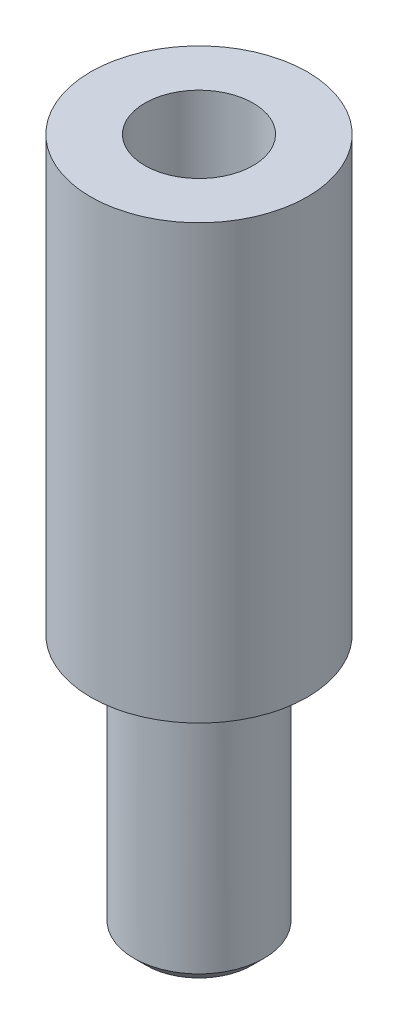
ISO-10303-21;
HEADER;
FILE_DESCRIPTION(('STEP AP214'),'2;1');
FILE_NAME('part.step','',(''),(''),'','','');
FILE_SCHEMA(('AUTOMOTIVE_DESIGN { 1 0 10303 214 1 1 1 1 }'));
ENDSEC;
DATA;
#1=APPLICATION_CONTEXT('core data for automotive mechanical design processes');
#2=APPLICATION_PROTOCOL_DEFINITION('international standard','automotive_design',2000,#1);
#3=PRODUCT_CONTEXT('',#1,'mechanical');
#4=PRODUCT('Part','Part','',(#3));
#5=PRODUCT_RELATED_PRODUCT_CATEGORY('part','',(#4));
#6=PRODUCT_DEFINITION_FORMATION('','',#4);
#7=PRODUCT_DEFINITION_CONTEXT('part definition',#1,'design');
#8=PRODUCT_DEFINITION('design','',#6,#7);
#9=PRODUCT_DEFINITION_SHAPE('','',#8);
#10=(LENGTH_UNIT() NAMED_UNIT(*) SI_UNIT(.MILLI.,.METRE.));
#11=(NAMED_UNIT(*) PLANE_ANGLE_UNIT() SI_UNIT($,.RADIAN.));
#12=(NAMED_UNIT(*) SI_UNIT($,.STERADIAN.) SOLID_ANGLE_UNIT());
#13=UNCERTAINTY_MEASURE_WITH_UNIT(LENGTH_MEASURE(1.E-05),#10,'distance_accuracy_value','');
#14=(GEOMETRIC_REPRESENTATION_CONTEXT(3) GLOBAL_UNCERTAINTY_ASSIGNED_CONTEXT((#13)) GLOBAL_UNIT_ASSIGNED_CONTEXT((#10,
#11,#12)) REPRESENTATION_CONTEXT('',''));
#15=CARTESIAN_POINT('',(0.,0.,0.));
#16=DIRECTION('',(0.,0.,1.));
#17=DIRECTION('',(1.,0.,0.));
#18=AXIS2_PLACEMENT_3D('',#15,#16,#17);
#19=CARTESIAN_POINT('',(0.,0.,0.));
#20=DIRECTION('',(0.,-1.,0.));
#21=DIRECTION('',(0.,0.,-1.));
#22=AXIS2_PLACEMENT_3D('',#19,#20,#21);
#23=CYLINDRICAL_SURFACE('',#22,1.5);
#24=CARTESIAN_POINT('',(0.,0.280499999999989,0.));
#25=DIRECTION('',(0.,1.,0.));
#26=DIRECTION('',(0.,0.,1.));
#27=AXIS2_PLACEMENT_3D('',#24,#25,#26);
#28=CIRCLE('',#27,1.5);
#29=CARTESIAN_POINT('',(0.,0.280499999999989,1.5));
#30=VERTEX_POINT('',#29);
#31=EDGE_CURVE('E68',#30,#30,#28,.T.);
#32=ORIENTED_EDGE('',*,*,#31,.T.);
#33=EDGE_LOOP('',(#32));
#34=FACE_BOUND('',#33,.T.);
#35=CARTESIAN_POINT('',(0.,6.,0.));
#36=DIRECTION('',(0.,-1.,0.));
#37=DIRECTION('',(0.,0.,-1.));
#38=AXIS2_PLACEMENT_3D('',#35,#36,#37);
#39=CIRCLE('',#38,1.5);
#40=CARTESIAN_POINT('',(0.,6.,-1.5));
#41=VERTEX_POINT('',#40);
#42=EDGE_CURVE('E11',#41,#41,#39,.T.);
#43=ORIENTED_EDGE('',*,*,#42,.T.);
#44=EDGE_LOOP('',(#43));
#45=FACE_BOUND('',#44,.T.);
#46=ADVANCED_FACE('F45',(#34,#45),#23,.T.);
#47=CARTESIAN_POINT('',(1.5,6.,0.));
#48=DIRECTION('',(0.,-1.,0.));
#49=DIRECTION('',(0.,0.,-1.));
#50=AXIS2_PLACEMENT_3D('',#47,#48,#49);
#51=PLANE('',#50);
#52=CARTESIAN_POINT('',(0.,6.,0.));
#53=DIRECTION('',(0.,-1.,0.));
#54=DIRECTION('',(0.,0.,-1.));
#55=AXIS2_PLACEMENT_3D('',#52,#53,#54);
#56=CIRCLE('',#55,2.5);
#57=CARTESIAN_POINT('',(0.,6.,-2.5));
#58=VERTEX_POINT('',#57);
#59=EDGE_CURVE('E52',#58,#58,#56,.T.);
#60=ORIENTED_EDGE('',*,*,#59,.T.);
#61=EDGE_LOOP('',(#60));
#62=FACE_BOUND('',#61,.T.);
#63=ORIENTED_EDGE('',*,*,#42,.F.);
#64=EDGE_LOOP('',(#63));
#65=FACE_BOUND('',#64,.T.);
#66=ADVANCED_FACE('F80',(#62,#65),#51,.T.);
#67=CARTESIAN_POINT('',(0.,0.,0.));
#68=DIRECTION('',(0.,-1.,0.));
#69=DIRECTION('',(0.,0.,-1.));
#70=AXIS2_PLACEMENT_3D('',#67,#68,#69);
#71=CYLINDRICAL_SURFACE('',#70,2.5);
#72=CARTESIAN_POINT('',(0.,16.,0.));
#73=DIRECTION('',(0.,-1.,0.));
#74=DIRECTION('',(0.,0.,-1.));
#75=AXIS2_PLACEMENT_3D('',#72,#73,#74);
#76=CIRCLE('',#75,2.5);
#77=CARTESIAN_POINT('',(0.,16.,-2.5));
#78=VERTEX_POINT('',#77);
#79=EDGE_CURVE('E75',#78,#78,#76,.T.);
#80=ORIENTED_EDGE('',*,*,#79,.T.);
#81=EDGE_LOOP('',(#80));
#82=FACE_BOUND('',#81,.T.);
#83=ORIENTED_EDGE('',*,*,#59,.F.);
#84=EDGE_LOOP('',(#83));
#85=FACE_BOUND('',#84,.T.);
#86=ADVANCED_FACE('F83',(#82,#85),#71,.T.);
#87=CARTESIAN_POINT('',(2.5,16.,0.));
#88=DIRECTION('',(0.,1.,0.));
#89=DIRECTION('',(0.,0.,1.));
#90=AXIS2_PLACEMENT_3D('',#87,#88,#89);
#91=PLANE('',#90);
#92=CARTESIAN_POINT('',(0.,16.,0.));
#93=DIRECTION('',(0.,1.,0.));
#94=DIRECTION('',(0.,0.,1.));
#95=AXIS2_PLACEMENT_3D('',#92,#93,#94);
#96=CIRCLE('',#95,1.25);
#97=CARTESIAN_POINT('',(0.,16.,1.25));
#98=VERTEX_POINT('',#97);
#99=EDGE_CURVE('E65',#98,#98,#96,.T.);
#100=ORIENTED_EDGE('',*,*,#99,.F.);
#101=EDGE_LOOP('',(#100));
#102=FACE_BOUND('',#101,.T.);
#103=ORIENTED_EDGE('',*,*,#79,.F.);
#104=EDGE_LOOP('',(#103));
#105=FACE_BOUND('',#104,.T.);
#106=ADVANCED_FACE('F85',(#102,#105),#91,.T.);
#107=CARTESIAN_POINT('',(0.,0.,0.));
#108=DIRECTION('',(0.,1.,0.));
#109=DIRECTION('',(0.,0.,1.));
#110=AXIS2_PLACEMENT_3D('',#107,#108,#109);
#111=CONICAL_SURFACE('',#110,1.2195,0.78539816339747);
#112=ORIENTED_EDGE('',*,*,#31,.F.);
#113=EDGE_LOOP('',(#112));
#114=FACE_BOUND('',#113,.T.);
#115=CARTESIAN_POINT('',(0.,0.,0.));
#116=DIRECTION('',(0.,1.,0.));
#117=DIRECTION('',(0.,0.,1.));
#118=AXIS2_PLACEMENT_3D('',#115,#116,#117);
#119=CIRCLE('',#118,1.2195);
#120=CARTESIAN_POINT('',(0.,0.,1.2195));
#121=VERTEX_POINT('',#120);
#122=EDGE_CURVE('E64',#121,#121,#119,.T.);
#123=ORIENTED_EDGE('',*,*,#122,.T.);
#124=EDGE_LOOP('',(#123));
#125=FACE_BOUND('',#124,.T.);
#126=ADVANCED_FACE('F93',(#114,#125),#111,.T.);
#127=CARTESIAN_POINT('',(0.,0.,0.));
#128=DIRECTION('',(0.,-1.,0.));
#129=DIRECTION('',(0.,0.,-1.));
#130=AXIS2_PLACEMENT_3D('',#127,#128,#129);
#131=PLANE('',#130);
#132=ORIENTED_EDGE('',*,*,#122,.F.);
#133=EDGE_LOOP('',(#132));
#134=FACE_BOUND('',#133,.T.);
#135=ADVANCED_FACE('F47',(#134),#131,.T.);
#136=CARTESIAN_POINT('',(0.,8.25107577378445,0.));
#137=DIRECTION('',(0.,1.,0.));
#138=DIRECTION('',(0.,0.,1.));
#139=AXIS2_PLACEMENT_3D('',#136,#137,#138);
#140=CONICAL_SURFACE('',#139,1.25,1.02974425867665);
#141=CARTESIAN_POINT('',(0.,7.5,0.));
#142=VERTEX_POINT('',#141);
#143=VERTEX_LOOP('',#142);
#144=FACE_BOUND('',#143,.T.);
#145=CARTESIAN_POINT('',(0.,8.25107577378445,0.));
#146=DIRECTION('',(0.,1.,0.));
#147=DIRECTION('',(0.,0.,1.));
#148=AXIS2_PLACEMENT_3D('',#145,#146,#147);
#149=CIRCLE('',#148,1.25);
#150=CARTESIAN_POINT('',(0.,8.25107577378445,1.25));
#151=VERTEX_POINT('',#150);
#152=EDGE_CURVE('E62',#151,#151,#149,.T.);
#153=ORIENTED_EDGE('',*,*,#152,.T.);
#154=EDGE_LOOP('',(#153));
#155=FACE_BOUND('',#154,.T.);
#156=ADVANCED_FACE('F55',(#144,#155),#140,.F.);
#157=CARTESIAN_POINT('',(0.,16.,0.));
#158=DIRECTION('',(0.,1.,0.));
#159=DIRECTION('',(0.,0.,1.));
#160=AXIS2_PLACEMENT_3D('',#157,#158,#159);
#161=CYLINDRICAL_SURFACE('',#160,1.25);
#162=ORIENTED_EDGE('',*,*,#152,.F.);
#163=EDGE_LOOP('',(#162));
#164=FACE_BOUND('',#163,.T.);
#165=ORIENTED_EDGE('',*,*,#99,.T.);
#166=EDGE_LOOP('',(#165));
#167=FACE_BOUND('',#166,.T.);
#168=ADVANCED_FACE('F58',(#164,#167),#161,.F.);
#169=CLOSED_SHELL('',(#46,#66,#86,#106,#126,#135,#156,#168));
#170=MANIFOLD_SOLID_BREP('B2',#169);
#171=ADVANCED_BREP_SHAPE_REPRESENTATION('',(#18,#170),#14);
#172=SHAPE_DEFINITION_REPRESENTATION(#9,#171);
ENDSEC;
END-ISO-10303-21;
